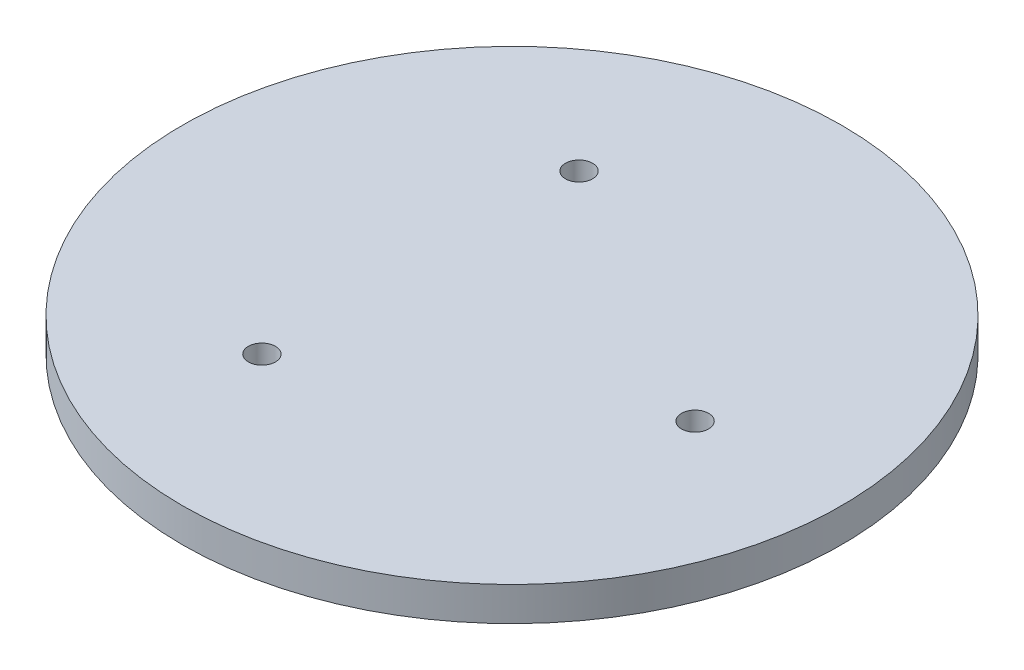
ISO-10303-21;
HEADER;
FILE_DESCRIPTION(('STEP AP214'),'2;1');
FILE_NAME('part.step','',(''),(''),'','','');
FILE_SCHEMA(('AUTOMOTIVE_DESIGN { 1 0 10303 214 1 1 1 1 }'));
ENDSEC;
DATA;
#1=APPLICATION_CONTEXT('core data for automotive mechanical design processes');
#2=APPLICATION_PROTOCOL_DEFINITION('international standard','automotive_design',2000,#1);
#3=PRODUCT_CONTEXT('',#1,'mechanical');
#4=PRODUCT('Part','Part','',(#3));
#5=PRODUCT_RELATED_PRODUCT_CATEGORY('part','',(#4));
#6=PRODUCT_DEFINITION_FORMATION('','',#4);
#7=PRODUCT_DEFINITION_CONTEXT('part definition',#1,'design');
#8=PRODUCT_DEFINITION('design','',#6,#7);
#9=PRODUCT_DEFINITION_SHAPE('','',#8);
#10=(LENGTH_UNIT() NAMED_UNIT(*) SI_UNIT(.MILLI.,.METRE.));
#11=(NAMED_UNIT(*) PLANE_ANGLE_UNIT() SI_UNIT($,.RADIAN.));
#12=(NAMED_UNIT(*) SI_UNIT($,.STERADIAN.) SOLID_ANGLE_UNIT());
#13=UNCERTAINTY_MEASURE_WITH_UNIT(LENGTH_MEASURE(1.E-05),#10,'distance_accuracy_value','');
#14=(GEOMETRIC_REPRESENTATION_CONTEXT(3) GLOBAL_UNCERTAINTY_ASSIGNED_CONTEXT((#13)) GLOBAL_UNIT_ASSIGNED_CONTEXT((#10,
#11,#12)) REPRESENTATION_CONTEXT('',''));
#15=CARTESIAN_POINT('',(0.,0.,0.));
#16=DIRECTION('',(0.,0.,1.));
#17=DIRECTION('',(1.,0.,0.));
#18=AXIS2_PLACEMENT_3D('',#15,#16,#17);
#19=CARTESIAN_POINT('',(-13.5,6.,23.3826859021798));
#20=DIRECTION('',(0.,-1.,0.));
#21=DIRECTION('',(0.,0.,-1.));
#22=AXIS2_PLACEMENT_3D('',#19,#20,#21);
#23=CYLINDRICAL_SURFACE('',#22,2.);
#24=CARTESIAN_POINT('',(-13.5,6.,23.3826859021798));
#25=DIRECTION('',(0.,1.,0.));
#26=DIRECTION('',(0.,0.,1.));
#27=AXIS2_PLACEMENT_3D('',#24,#25,#26);
#28=CIRCLE('',#27,2.);
#29=CARTESIAN_POINT('',(-13.5,6.,25.3826859021798));
#30=VERTEX_POINT('',#29);
#31=EDGE_CURVE('E22',#30,#30,#28,.T.);
#32=ORIENTED_EDGE('',*,*,#31,.T.);
#33=EDGE_LOOP('',(#32));
#34=FACE_BOUND('',#33,.T.);
#35=CARTESIAN_POINT('',(-13.5,1.,23.3826859021798));
#36=DIRECTION('',(0.,1.,0.));
#37=DIRECTION('',(0.,0.,1.));
#38=AXIS2_PLACEMENT_3D('',#35,#36,#37);
#39=CIRCLE('',#38,2.);
#40=CARTESIAN_POINT('',(-13.5,1.,25.3826859021798));
#41=VERTEX_POINT('',#40);
#42=EDGE_CURVE('E43',#41,#41,#39,.T.);
#43=ORIENTED_EDGE('',*,*,#42,.F.);
#44=EDGE_LOOP('',(#43));
#45=FACE_BOUND('',#44,.T.);
#46=ADVANCED_FACE('F13',(#34,#45),#23,.F.);
#47=CARTESIAN_POINT('',(27.,6.,0.));
#48=DIRECTION('',(0.,-1.,0.));
#49=DIRECTION('',(0.,0.,-1.));
#50=AXIS2_PLACEMENT_3D('',#47,#48,#49);
#51=CYLINDRICAL_SURFACE('',#50,2.);
#52=CARTESIAN_POINT('',(27.,6.,0.));
#53=DIRECTION('',(0.,1.,0.));
#54=DIRECTION('',(0.,0.,1.));
#55=AXIS2_PLACEMENT_3D('',#52,#53,#54);
#56=CIRCLE('',#55,2.);
#57=CARTESIAN_POINT('',(27.,6.,2.));
#58=VERTEX_POINT('',#57);
#59=EDGE_CURVE('E32',#58,#58,#56,.T.);
#60=ORIENTED_EDGE('',*,*,#59,.T.);
#61=EDGE_LOOP('',(#60));
#62=FACE_BOUND('',#61,.T.);
#63=CARTESIAN_POINT('',(27.,1.,0.));
#64=DIRECTION('',(0.,1.,0.));
#65=DIRECTION('',(0.,0.,1.));
#66=AXIS2_PLACEMENT_3D('',#63,#64,#65);
#67=CIRCLE('',#66,2.);
#68=CARTESIAN_POINT('',(27.,1.,2.));
#69=VERTEX_POINT('',#68);
#70=EDGE_CURVE('E40',#69,#69,#67,.T.);
#71=ORIENTED_EDGE('',*,*,#70,.F.);
#72=EDGE_LOOP('',(#71));
#73=FACE_BOUND('',#72,.T.);
#74=ADVANCED_FACE('F65',(#62,#73),#51,.F.);
#75=CARTESIAN_POINT('',(-13.5,6.,-23.3826859021798));
#76=DIRECTION('',(0.,-1.,0.));
#77=DIRECTION('',(0.,0.,-1.));
#78=AXIS2_PLACEMENT_3D('',#75,#76,#77);
#79=CYLINDRICAL_SURFACE('',#78,2.);
#80=CARTESIAN_POINT('',(-13.5,6.,-23.3826859021798));
#81=DIRECTION('',(0.,1.,0.));
#82=DIRECTION('',(0.,0.,1.));
#83=AXIS2_PLACEMENT_3D('',#80,#81,#82);
#84=CIRCLE('',#83,2.);
#85=CARTESIAN_POINT('',(-13.5,6.,-21.3826859021799));
#86=VERTEX_POINT('',#85);
#87=EDGE_CURVE('E49',#86,#86,#84,.T.);
#88=ORIENTED_EDGE('',*,*,#87,.T.);
#89=EDGE_LOOP('',(#88));
#90=FACE_BOUND('',#89,.T.);
#91=CARTESIAN_POINT('',(-13.5,1.,-23.3826859021798));
#92=DIRECTION('',(0.,1.,0.));
#93=DIRECTION('',(0.,0.,1.));
#94=AXIS2_PLACEMENT_3D('',#91,#92,#93);
#95=CIRCLE('',#94,2.);
#96=CARTESIAN_POINT('',(-13.5,1.,-21.3826859021799));
#97=VERTEX_POINT('',#96);
#98=EDGE_CURVE('E36',#97,#97,#95,.T.);
#99=ORIENTED_EDGE('',*,*,#98,.F.);
#100=EDGE_LOOP('',(#99));
#101=FACE_BOUND('',#100,.T.);
#102=ADVANCED_FACE('F15',(#90,#101),#79,.F.);
#103=CARTESIAN_POINT('',(0.,6.,0.));
#104=DIRECTION('',(0.,-1.,0.));
#105=DIRECTION('',(0.,0.,-1.));
#106=AXIS2_PLACEMENT_3D('',#103,#104,#105);
#107=CYLINDRICAL_SURFACE('',#106,48.6);
#108=CARTESIAN_POINT('',(0.,6.,0.));
#109=DIRECTION('',(0.,1.,0.));
#110=DIRECTION('',(0.,0.,1.));
#111=AXIS2_PLACEMENT_3D('',#108,#109,#110);
#112=CIRCLE('',#111,48.6);
#113=CARTESIAN_POINT('',(0.,6.,48.6));
#114=VERTEX_POINT('',#113);
#115=EDGE_CURVE('E9',#114,#114,#112,.T.);
#116=ORIENTED_EDGE('',*,*,#115,.F.);
#117=EDGE_LOOP('',(#116));
#118=FACE_BOUND('',#117,.T.);
#119=CARTESIAN_POINT('',(0.,1.,0.));
#120=DIRECTION('',(0.,1.,0.));
#121=DIRECTION('',(0.,0.,1.));
#122=AXIS2_PLACEMENT_3D('',#119,#120,#121);
#123=CIRCLE('',#122,48.6);
#124=CARTESIAN_POINT('',(0.,1.,48.6));
#125=VERTEX_POINT('',#124);
#126=EDGE_CURVE('E17',#125,#125,#123,.T.);
#127=ORIENTED_EDGE('',*,*,#126,.T.);
#128=EDGE_LOOP('',(#127));
#129=FACE_BOUND('',#128,.T.);
#130=ADVANCED_FACE('F72',(#118,#129),#107,.T.);
#131=CARTESIAN_POINT('',(0.,6.,0.));
#132=DIRECTION('',(0.,1.,0.));
#133=DIRECTION('',(-1.,0.,0.));
#134=AXIS2_PLACEMENT_3D('',#131,#132,#133);
#135=PLANE('',#134);
#136=ORIENTED_EDGE('',*,*,#87,.F.);
#137=EDGE_LOOP('',(#136));
#138=FACE_BOUND('',#137,.T.);
#139=ORIENTED_EDGE('',*,*,#59,.F.);
#140=EDGE_LOOP('',(#139));
#141=FACE_BOUND('',#140,.T.);
#142=ORIENTED_EDGE('',*,*,#31,.F.);
#143=EDGE_LOOP('',(#142));
#144=FACE_BOUND('',#143,.T.);
#145=ORIENTED_EDGE('',*,*,#115,.T.);
#146=EDGE_LOOP('',(#145));
#147=FACE_BOUND('',#146,.T.);
#148=ADVANCED_FACE('F68',(#138,#141,#144,#147),#135,.T.);
#149=CARTESIAN_POINT('',(0.,1.,0.));
#150=DIRECTION('',(0.,1.,0.));
#151=DIRECTION('',(-1.,0.,0.));
#152=AXIS2_PLACEMENT_3D('',#149,#150,#151);
#153=PLANE('',#152);
#154=ORIENTED_EDGE('',*,*,#98,.T.);
#155=EDGE_LOOP('',(#154));
#156=FACE_BOUND('',#155,.T.);
#157=ORIENTED_EDGE('',*,*,#70,.T.);
#158=EDGE_LOOP('',(#157));
#159=FACE_BOUND('',#158,.T.);
#160=ORIENTED_EDGE('',*,*,#42,.T.);
#161=EDGE_LOOP('',(#160));
#162=FACE_BOUND('',#161,.T.);
#163=ORIENTED_EDGE('',*,*,#126,.F.);
#164=EDGE_LOOP('',(#163));
#165=FACE_BOUND('',#164,.T.);
#166=ADVANCED_FACE('F71',(#156,#159,#162,#165),#153,.F.);
#167=CLOSED_SHELL('',(#46,#74,#102,#130,#148,#166));
#168=MANIFOLD_SOLID_BREP('B1',#167);
#169=ADVANCED_BREP_SHAPE_REPRESENTATION('',(#18,#168),#14);
#170=SHAPE_DEFINITION_REPRESENTATION(#9,#169);
ENDSEC;
END-ISO-10303-21;
